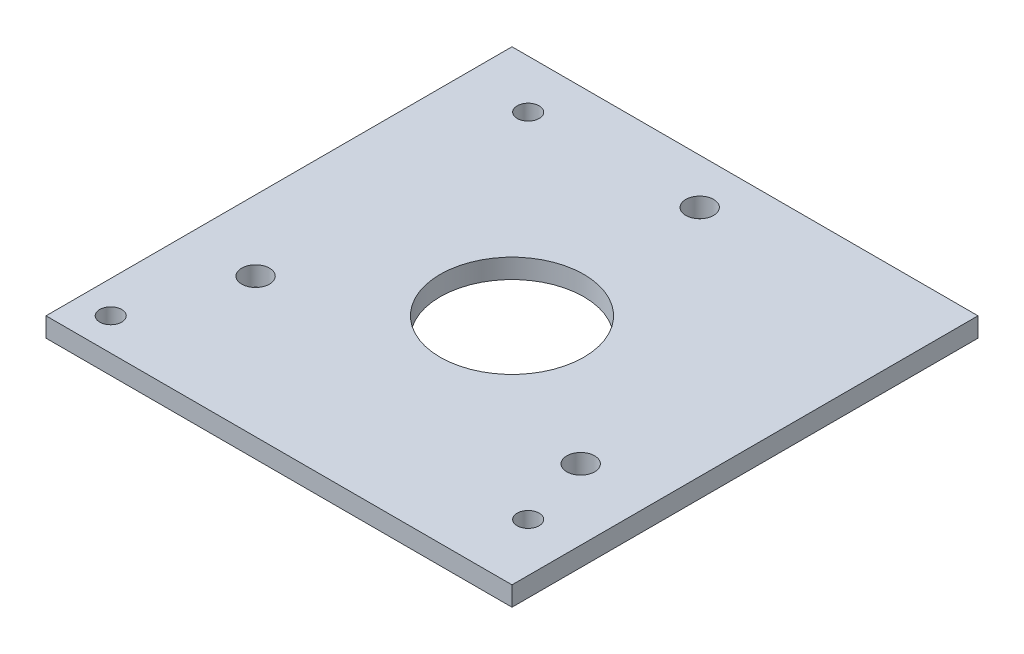
ISO-10303-21;
HEADER;
FILE_DESCRIPTION(('STEP AP214'),'2;1');
FILE_NAME('part.step','',(''),(''),'','','');
FILE_SCHEMA(('AUTOMOTIVE_DESIGN { 1 0 10303 214 1 1 1 1 }'));
ENDSEC;
DATA;
#1=APPLICATION_CONTEXT('core data for automotive mechanical design processes');
#2=APPLICATION_PROTOCOL_DEFINITION('international standard','automotive_design',2000,#1);
#3=PRODUCT_CONTEXT('',#1,'mechanical');
#4=PRODUCT('Part','Part','',(#3));
#5=PRODUCT_RELATED_PRODUCT_CATEGORY('part','',(#4));
#6=PRODUCT_DEFINITION_FORMATION('','',#4);
#7=PRODUCT_DEFINITION_CONTEXT('part definition',#1,'design');
#8=PRODUCT_DEFINITION('design','',#6,#7);
#9=PRODUCT_DEFINITION_SHAPE('','',#8);
#10=(LENGTH_UNIT() NAMED_UNIT(*) SI_UNIT(.MILLI.,.METRE.));
#11=(NAMED_UNIT(*) PLANE_ANGLE_UNIT() SI_UNIT($,.RADIAN.));
#12=(NAMED_UNIT(*) SI_UNIT($,.STERADIAN.) SOLID_ANGLE_UNIT());
#13=UNCERTAINTY_MEASURE_WITH_UNIT(LENGTH_MEASURE(1.E-05),#10,'distance_accuracy_value','');
#14=(GEOMETRIC_REPRESENTATION_CONTEXT(3) GLOBAL_UNCERTAINTY_ASSIGNED_CONTEXT((#13)) GLOBAL_UNIT_ASSIGNED_CONTEXT((#10,
#11,#12)) REPRESENTATION_CONTEXT('',''));
#15=CARTESIAN_POINT('',(0.,0.,0.));
#16=DIRECTION('',(0.,0.,1.));
#17=DIRECTION('',(1.,0.,0.));
#18=AXIS2_PLACEMENT_3D('',#15,#16,#17);
#19=CARTESIAN_POINT('',(0.,3.,0.));
#20=DIRECTION('',(0.,1.,0.));
#21=DIRECTION('',(0.,0.,1.));
#22=AXIS2_PLACEMENT_3D('',#19,#20,#21);
#23=PLANE('',#22);
#24=CARTESIAN_POINT('',(-31.,3.,31.));
#25=DIRECTION('',(0.,1.,0.));
#26=DIRECTION('',(0.,0.,1.));
#27=AXIS2_PLACEMENT_3D('',#24,#25,#26);
#28=CIRCLE('',#27,1.7);
#29=CARTESIAN_POINT('',(-31.,3.,32.7));
#30=VERTEX_POINT('',#29);
#31=EDGE_CURVE('E175',#30,#30,#28,.T.);
#32=ORIENTED_EDGE('',*,*,#31,.F.);
#33=EDGE_LOOP('',(#32));
#34=FACE_BOUND('',#33,.T.);
#35=CARTESIAN_POINT('',(-25.1147367097469,3.,14.5000000000011));
#36=DIRECTION('',(0.,1.,0.));
#37=DIRECTION('',(0.,0.,1.));
#38=AXIS2_PLACEMENT_3D('',#35,#36,#37);
#39=CIRCLE('',#38,2.15000000000233);
#40=CARTESIAN_POINT('',(-25.1147367097469,3.,16.6500000000034));
#41=VERTEX_POINT('',#40);
#42=EDGE_CURVE('E157',#41,#41,#39,.T.);
#43=ORIENTED_EDGE('',*,*,#42,.F.);
#44=EDGE_LOOP('',(#43));
#45=FACE_BOUND('',#44,.T.);
#46=CARTESIAN_POINT('',(0.,3.,-29.));
#47=DIRECTION('',(0.,1.,0.));
#48=DIRECTION('',(0.,0.,1.));
#49=AXIS2_PLACEMENT_3D('',#46,#47,#48);
#50=CIRCLE('',#49,2.15);
#51=CARTESIAN_POINT('',(0.,3.,-26.85));
#52=VERTEX_POINT('',#51);
#53=EDGE_CURVE('E139',#52,#52,#50,.T.);
#54=ORIENTED_EDGE('',*,*,#53,.F.);
#55=EDGE_LOOP('',(#54));
#56=FACE_BOUND('',#55,.T.);
#57=DIRECTION('',(0.,0.,1.));
#58=VECTOR('',#57,1.);
#59=CARTESIAN_POINT('',(-36.,3.,36.));
#60=LINE('',#59,#58);
#61=CARTESIAN_POINT('',(-36.,3.,-36.));
#62=VERTEX_POINT('',#61);
#63=CARTESIAN_POINT('',(-36.,3.,36.));
#64=VERTEX_POINT('',#63);
#65=EDGE_CURVE('E97',#62,#64,#60,.T.);
#66=ORIENTED_EDGE('',*,*,#65,.T.);
#67=DIRECTION('',(1.,0.,0.));
#68=VECTOR('',#67,1.);
#69=CARTESIAN_POINT('',(36.,3.,36.));
#70=LINE('',#69,#68);
#71=CARTESIAN_POINT('',(36.,3.,36.));
#72=VERTEX_POINT('',#71);
#73=EDGE_CURVE('E93',#64,#72,#70,.T.);
#74=ORIENTED_EDGE('',*,*,#73,.T.);
#75=DIRECTION('',(0.,0.,-1.));
#76=VECTOR('',#75,1.);
#77=CARTESIAN_POINT('',(36.,3.,36.));
#78=LINE('',#77,#76);
#79=CARTESIAN_POINT('',(36.,3.,-36.));
#80=VERTEX_POINT('',#79);
#81=EDGE_CURVE('E96',#72,#80,#78,.T.);
#82=ORIENTED_EDGE('',*,*,#81,.T.);
#83=DIRECTION('',(-1.,0.,0.));
#84=VECTOR('',#83,1.);
#85=CARTESIAN_POINT('',(36.,3.,-36.));
#86=LINE('',#85,#84);
#87=EDGE_CURVE('E62',#80,#62,#86,.T.);
#88=ORIENTED_EDGE('',*,*,#87,.T.);
#89=EDGE_LOOP('',(#66,#74,#82,#88));
#90=FACE_BOUND('',#89,.T.);
#91=CARTESIAN_POINT('',(0.,3.,0.));
#92=DIRECTION('',(0.,1.,0.));
#93=DIRECTION('',(0.,0.,1.));
#94=AXIS2_PLACEMENT_3D('',#91,#92,#93);
#95=CIRCLE('',#94,11.1);
#96=CARTESIAN_POINT('',(0.,3.,11.1));
#97=VERTEX_POINT('',#96);
#98=EDGE_CURVE('E117',#97,#97,#95,.T.);
#99=ORIENTED_EDGE('',*,*,#98,.F.);
#100=EDGE_LOOP('',(#99));
#101=FACE_BOUND('',#100,.T.);
#102=CARTESIAN_POINT('',(25.1147367097506,3.,14.4999999999989));
#103=DIRECTION('',(0.,1.,0.));
#104=DIRECTION('',(0.,0.,1.));
#105=AXIS2_PLACEMENT_3D('',#102,#103,#104);
#106=CIRCLE('',#105,2.15000000000159);
#107=CARTESIAN_POINT('',(25.1147367097506,3.,16.6500000000005));
#108=VERTEX_POINT('',#107);
#109=EDGE_CURVE('E149',#108,#108,#106,.T.);
#110=ORIENTED_EDGE('',*,*,#109,.F.);
#111=EDGE_LOOP('',(#110));
#112=FACE_BOUND('',#111,.T.);
#113=CARTESIAN_POINT('',(-26.,3.,-28.5));
#114=DIRECTION('',(0.,1.,0.));
#115=DIRECTION('',(0.,0.,1.));
#116=AXIS2_PLACEMENT_3D('',#113,#114,#115);
#117=CIRCLE('',#116,1.7);
#118=CARTESIAN_POINT('',(-26.,3.,-26.8));
#119=VERTEX_POINT('',#118);
#120=EDGE_CURVE('E165',#119,#119,#117,.T.);
#121=ORIENTED_EDGE('',*,*,#120,.F.);
#122=EDGE_LOOP('',(#121));
#123=FACE_BOUND('',#122,.T.);
#124=CARTESIAN_POINT('',(28.5,3.,26.));
#125=DIRECTION('',(0.,1.,0.));
#126=DIRECTION('',(0.,0.,1.));
#127=AXIS2_PLACEMENT_3D('',#124,#125,#126);
#128=CIRCLE('',#127,1.7);
#129=CARTESIAN_POINT('',(28.5,3.,27.7));
#130=VERTEX_POINT('',#129);
#131=EDGE_CURVE('E179',#130,#130,#128,.T.);
#132=ORIENTED_EDGE('',*,*,#131,.F.);
#133=EDGE_LOOP('',(#132));
#134=FACE_BOUND('',#133,.T.);
#135=ADVANCED_FACE('F44',(#34,#45,#56,#90,#101,#112,#123,#134),#23,.T.);
#136=CARTESIAN_POINT('',(0.,0.,0.));
#137=DIRECTION('',(0.,1.,0.));
#138=DIRECTION('',(0.,0.,1.));
#139=AXIS2_PLACEMENT_3D('',#136,#137,#138);
#140=PLANE('',#139);
#141=DIRECTION('',(0.,0.,1.));
#142=VECTOR('',#141,1.);
#143=CARTESIAN_POINT('',(-36.,0.,36.));
#144=LINE('',#143,#142);
#145=CARTESIAN_POINT('',(-36.,0.,-36.));
#146=VERTEX_POINT('',#145);
#147=CARTESIAN_POINT('',(-36.,0.,36.));
#148=VERTEX_POINT('',#147);
#149=EDGE_CURVE('E114',#146,#148,#144,.T.);
#150=ORIENTED_EDGE('',*,*,#149,.F.);
#151=DIRECTION('',(-1.,0.,0.));
#152=VECTOR('',#151,1.);
#153=CARTESIAN_POINT('',(36.,0.,-36.));
#154=LINE('',#153,#152);
#155=CARTESIAN_POINT('',(36.,0.,-36.));
#156=VERTEX_POINT('',#155);
#157=EDGE_CURVE('E86',#156,#146,#154,.T.);
#158=ORIENTED_EDGE('',*,*,#157,.F.);
#159=DIRECTION('',(0.,0.,-1.));
#160=VECTOR('',#159,1.);
#161=CARTESIAN_POINT('',(36.,0.,36.));
#162=LINE('',#161,#160);
#163=CARTESIAN_POINT('',(36.,0.,36.));
#164=VERTEX_POINT('',#163);
#165=EDGE_CURVE('E79',#164,#156,#162,.T.);
#166=ORIENTED_EDGE('',*,*,#165,.F.);
#167=DIRECTION('',(1.,0.,0.));
#168=VECTOR('',#167,1.);
#169=CARTESIAN_POINT('',(36.,0.,36.));
#170=LINE('',#169,#168);
#171=EDGE_CURVE('E104',#148,#164,#170,.T.);
#172=ORIENTED_EDGE('',*,*,#171,.F.);
#173=EDGE_LOOP('',(#150,#158,#166,#172));
#174=FACE_BOUND('',#173,.T.);
#175=CARTESIAN_POINT('',(0.,0.,0.));
#176=DIRECTION('',(0.,1.,0.));
#177=DIRECTION('',(0.,0.,1.));
#178=AXIS2_PLACEMENT_3D('',#175,#176,#177);
#179=CIRCLE('',#178,11.1);
#180=CARTESIAN_POINT('',(0.,0.,11.1));
#181=VERTEX_POINT('',#180);
#182=EDGE_CURVE('E136',#181,#181,#179,.T.);
#183=ORIENTED_EDGE('',*,*,#182,.T.);
#184=EDGE_LOOP('',(#183));
#185=FACE_BOUND('',#184,.T.);
#186=CARTESIAN_POINT('',(0.,0.,-29.));
#187=DIRECTION('',(0.,1.,0.));
#188=DIRECTION('',(0.,0.,1.));
#189=AXIS2_PLACEMENT_3D('',#186,#187,#188);
#190=CIRCLE('',#189,2.15);
#191=CARTESIAN_POINT('',(0.,0.,-26.85));
#192=VERTEX_POINT('',#191);
#193=EDGE_CURVE('E143',#192,#192,#190,.T.);
#194=ORIENTED_EDGE('',*,*,#193,.T.);
#195=EDGE_LOOP('',(#194));
#196=FACE_BOUND('',#195,.T.);
#197=CARTESIAN_POINT('',(25.1147367097506,0.,14.4999999999989));
#198=DIRECTION('',(0.,1.,0.));
#199=DIRECTION('',(0.,0.,1.));
#200=AXIS2_PLACEMENT_3D('',#197,#198,#199);
#201=CIRCLE('',#200,2.15000000000159);
#202=CARTESIAN_POINT('',(25.1147367097506,0.,16.6500000000005));
#203=VERTEX_POINT('',#202);
#204=EDGE_CURVE('E154',#203,#203,#201,.T.);
#205=ORIENTED_EDGE('',*,*,#204,.T.);
#206=EDGE_LOOP('',(#205));
#207=FACE_BOUND('',#206,.T.);
#208=CARTESIAN_POINT('',(-25.1147367097469,0.,14.5000000000011));
#209=DIRECTION('',(0.,1.,0.));
#210=DIRECTION('',(0.,0.,1.));
#211=AXIS2_PLACEMENT_3D('',#208,#209,#210);
#212=CIRCLE('',#211,2.15000000000233);
#213=CARTESIAN_POINT('',(-25.1147367097469,0.,16.6500000000034));
#214=VERTEX_POINT('',#213);
#215=EDGE_CURVE('E158',#214,#214,#212,.T.);
#216=ORIENTED_EDGE('',*,*,#215,.T.);
#217=EDGE_LOOP('',(#216));
#218=FACE_BOUND('',#217,.T.);
#219=CARTESIAN_POINT('',(-26.,0.,-28.5));
#220=DIRECTION('',(0.,1.,0.));
#221=DIRECTION('',(0.,0.,1.));
#222=AXIS2_PLACEMENT_3D('',#219,#220,#221);
#223=CIRCLE('',#222,1.7);
#224=CARTESIAN_POINT('',(-26.,0.,-26.8));
#225=VERTEX_POINT('',#224);
#226=EDGE_CURVE('E166',#225,#225,#223,.T.);
#227=ORIENTED_EDGE('',*,*,#226,.T.);
#228=EDGE_LOOP('',(#227));
#229=FACE_BOUND('',#228,.T.);
#230=CARTESIAN_POINT('',(-31.,0.,31.));
#231=DIRECTION('',(0.,1.,0.));
#232=DIRECTION('',(0.,0.,1.));
#233=AXIS2_PLACEMENT_3D('',#230,#231,#232);
#234=CIRCLE('',#233,1.7);
#235=CARTESIAN_POINT('',(-31.,0.,32.7));
#236=VERTEX_POINT('',#235);
#237=EDGE_CURVE('E176',#236,#236,#234,.T.);
#238=ORIENTED_EDGE('',*,*,#237,.T.);
#239=EDGE_LOOP('',(#238));
#240=FACE_BOUND('',#239,.T.);
#241=CARTESIAN_POINT('',(28.5,0.,26.));
#242=DIRECTION('',(0.,1.,0.));
#243=DIRECTION('',(0.,0.,1.));
#244=AXIS2_PLACEMENT_3D('',#241,#242,#243);
#245=CIRCLE('',#244,1.7);
#246=CARTESIAN_POINT('',(28.5,0.,27.7));
#247=VERTEX_POINT('',#246);
#248=EDGE_CURVE('E182',#247,#247,#245,.T.);
#249=ORIENTED_EDGE('',*,*,#248,.T.);
#250=EDGE_LOOP('',(#249));
#251=FACE_BOUND('',#250,.T.);
#252=ADVANCED_FACE('F131',(#174,#185,#196,#207,#218,#229,#240,#251),#140,.F.);
#253=CARTESIAN_POINT('',(-36.,3.,36.));
#254=DIRECTION('',(1.,0.,0.));
#255=DIRECTION('',(0.,0.,-1.));
#256=AXIS2_PLACEMENT_3D('',#253,#254,#255);
#257=PLANE('',#256);
#258=ORIENTED_EDGE('',*,*,#149,.T.);
#259=DIRECTION('',(0.,-1.,0.));
#260=VECTOR('',#259,1.);
#261=CARTESIAN_POINT('',(-36.,3.,36.));
#262=LINE('',#261,#260);
#263=EDGE_CURVE('E11',#64,#148,#262,.T.);
#264=ORIENTED_EDGE('',*,*,#263,.F.);
#265=ORIENTED_EDGE('',*,*,#65,.F.);
#266=DIRECTION('',(0.,-1.,0.));
#267=VECTOR('',#266,1.);
#268=CARTESIAN_POINT('',(-36.,3.,-36.));
#269=LINE('',#268,#267);
#270=EDGE_CURVE('E106',#62,#146,#269,.T.);
#271=ORIENTED_EDGE('',*,*,#270,.T.);
#272=EDGE_LOOP('',(#258,#264,#265,#271));
#273=FACE_BOUND('',#272,.T.);
#274=ADVANCED_FACE('F50',(#273),#257,.F.);
#275=CARTESIAN_POINT('',(36.,3.,36.));
#276=DIRECTION('',(0.,0.,-1.));
#277=DIRECTION('',(-1.,0.,0.));
#278=AXIS2_PLACEMENT_3D('',#275,#276,#277);
#279=PLANE('',#278);
#280=ORIENTED_EDGE('',*,*,#171,.T.);
#281=DIRECTION('',(0.,-1.,0.));
#282=VECTOR('',#281,1.);
#283=CARTESIAN_POINT('',(36.,3.,36.));
#284=LINE('',#283,#282);
#285=EDGE_CURVE('E54',#72,#164,#284,.T.);
#286=ORIENTED_EDGE('',*,*,#285,.F.);
#287=ORIENTED_EDGE('',*,*,#73,.F.);
#288=ORIENTED_EDGE('',*,*,#263,.T.);
#289=EDGE_LOOP('',(#280,#286,#287,#288));
#290=FACE_BOUND('',#289,.T.);
#291=ADVANCED_FACE('F105',(#290),#279,.F.);
#292=CARTESIAN_POINT('',(36.,3.,36.));
#293=DIRECTION('',(-1.,0.,0.));
#294=DIRECTION('',(0.,0.,1.));
#295=AXIS2_PLACEMENT_3D('',#292,#293,#294);
#296=PLANE('',#295);
#297=ORIENTED_EDGE('',*,*,#165,.T.);
#298=DIRECTION('',(0.,-1.,0.));
#299=VECTOR('',#298,1.);
#300=CARTESIAN_POINT('',(36.,3.,-36.));
#301=LINE('',#300,#299);
#302=EDGE_CURVE('E103',#80,#156,#301,.T.);
#303=ORIENTED_EDGE('',*,*,#302,.F.);
#304=ORIENTED_EDGE('',*,*,#81,.F.);
#305=ORIENTED_EDGE('',*,*,#285,.T.);
#306=EDGE_LOOP('',(#297,#303,#304,#305));
#307=FACE_BOUND('',#306,.T.);
#308=ADVANCED_FACE('F108',(#307),#296,.F.);
#309=CARTESIAN_POINT('',(36.,3.,-36.));
#310=DIRECTION('',(0.,0.,1.));
#311=DIRECTION('',(1.,0.,0.));
#312=AXIS2_PLACEMENT_3D('',#309,#310,#311);
#313=PLANE('',#312);
#314=ORIENTED_EDGE('',*,*,#157,.T.);
#315=ORIENTED_EDGE('',*,*,#270,.F.);
#316=ORIENTED_EDGE('',*,*,#87,.F.);
#317=ORIENTED_EDGE('',*,*,#302,.T.);
#318=EDGE_LOOP('',(#314,#315,#316,#317));
#319=FACE_BOUND('',#318,.T.);
#320=ADVANCED_FACE('F126',(#319),#313,.F.);
#321=CARTESIAN_POINT('',(0.,3.,0.));
#322=DIRECTION('',(0.,-1.,0.));
#323=DIRECTION('',(0.,0.,-1.));
#324=AXIS2_PLACEMENT_3D('',#321,#322,#323);
#325=CYLINDRICAL_SURFACE('',#324,11.1);
#326=ORIENTED_EDGE('',*,*,#98,.T.);
#327=EDGE_LOOP('',(#326));
#328=FACE_BOUND('',#327,.T.);
#329=ORIENTED_EDGE('',*,*,#182,.F.);
#330=EDGE_LOOP('',(#329));
#331=FACE_BOUND('',#330,.T.);
#332=ADVANCED_FACE('F203',(#328,#331),#325,.F.);
#333=CARTESIAN_POINT('',(0.,3.,-29.));
#334=DIRECTION('',(0.,-1.,0.));
#335=DIRECTION('',(0.,0.,-1.));
#336=AXIS2_PLACEMENT_3D('',#333,#334,#335);
#337=CYLINDRICAL_SURFACE('',#336,2.15);
#338=ORIENTED_EDGE('',*,*,#53,.T.);
#339=EDGE_LOOP('',(#338));
#340=FACE_BOUND('',#339,.T.);
#341=ORIENTED_EDGE('',*,*,#193,.F.);
#342=EDGE_LOOP('',(#341));
#343=FACE_BOUND('',#342,.T.);
#344=ADVANCED_FACE('F248',(#340,#343),#337,.F.);
#345=CARTESIAN_POINT('',(25.1147367097506,3.,14.4999999999989));
#346=DIRECTION('',(0.,-1.,0.));
#347=DIRECTION('',(0.,0.,-1.));
#348=AXIS2_PLACEMENT_3D('',#345,#346,#347);
#349=CYLINDRICAL_SURFACE('',#348,2.15000000000159);
#350=ORIENTED_EDGE('',*,*,#109,.T.);
#351=EDGE_LOOP('',(#350));
#352=FACE_BOUND('',#351,.T.);
#353=ORIENTED_EDGE('',*,*,#204,.F.);
#354=EDGE_LOOP('',(#353));
#355=FACE_BOUND('',#354,.T.);
#356=ADVANCED_FACE('F256',(#352,#355),#349,.F.);
#357=CARTESIAN_POINT('',(-25.1147367097469,3.,14.5000000000011));
#358=DIRECTION('',(0.,-1.,0.));
#359=DIRECTION('',(0.,0.,-1.));
#360=AXIS2_PLACEMENT_3D('',#357,#358,#359);
#361=CYLINDRICAL_SURFACE('',#360,2.15000000000233);
#362=ORIENTED_EDGE('',*,*,#42,.T.);
#363=EDGE_LOOP('',(#362));
#364=FACE_BOUND('',#363,.T.);
#365=ORIENTED_EDGE('',*,*,#215,.F.);
#366=EDGE_LOOP('',(#365));
#367=FACE_BOUND('',#366,.T.);
#368=ADVANCED_FACE('F266',(#364,#367),#361,.F.);
#369=CARTESIAN_POINT('',(-26.,3.,-28.5));
#370=DIRECTION('',(0.,-1.,0.));
#371=DIRECTION('',(0.,0.,-1.));
#372=AXIS2_PLACEMENT_3D('',#369,#370,#371);
#373=CYLINDRICAL_SURFACE('',#372,1.7);
#374=ORIENTED_EDGE('',*,*,#120,.T.);
#375=EDGE_LOOP('',(#374));
#376=FACE_BOUND('',#375,.T.);
#377=ORIENTED_EDGE('',*,*,#226,.F.);
#378=EDGE_LOOP('',(#377));
#379=FACE_BOUND('',#378,.T.);
#380=ADVANCED_FACE('F274',(#376,#379),#373,.F.);
#381=CARTESIAN_POINT('',(-31.,3.,31.));
#382=DIRECTION('',(0.,-1.,0.));
#383=DIRECTION('',(0.,0.,-1.));
#384=AXIS2_PLACEMENT_3D('',#381,#382,#383);
#385=CYLINDRICAL_SURFACE('',#384,1.7);
#386=ORIENTED_EDGE('',*,*,#31,.T.);
#387=EDGE_LOOP('',(#386));
#388=FACE_BOUND('',#387,.T.);
#389=ORIENTED_EDGE('',*,*,#237,.F.);
#390=EDGE_LOOP('',(#389));
#391=FACE_BOUND('',#390,.T.);
#392=ADVANCED_FACE('F281',(#388,#391),#385,.F.);
#393=CARTESIAN_POINT('',(28.5,3.,26.));
#394=DIRECTION('',(0.,-1.,0.));
#395=DIRECTION('',(0.,0.,-1.));
#396=AXIS2_PLACEMENT_3D('',#393,#394,#395);
#397=CYLINDRICAL_SURFACE('',#396,1.7);
#398=ORIENTED_EDGE('',*,*,#131,.T.);
#399=EDGE_LOOP('',(#398));
#400=FACE_BOUND('',#399,.T.);
#401=ORIENTED_EDGE('',*,*,#248,.F.);
#402=EDGE_LOOP('',(#401));
#403=FACE_BOUND('',#402,.T.);
#404=ADVANCED_FACE('F195',(#400,#403),#397,.F.);
#405=CLOSED_SHELL('',(#135,#252,#274,#291,#308,#320,#332,#344,#356,#368,#380,#392,#404));
#406=MANIFOLD_SOLID_BREP('B2',#405);
#407=ADVANCED_BREP_SHAPE_REPRESENTATION('',(#18,#406),#14);
#408=SHAPE_DEFINITION_REPRESENTATION(#9,#407);
ENDSEC;
END-ISO-10303-21;
